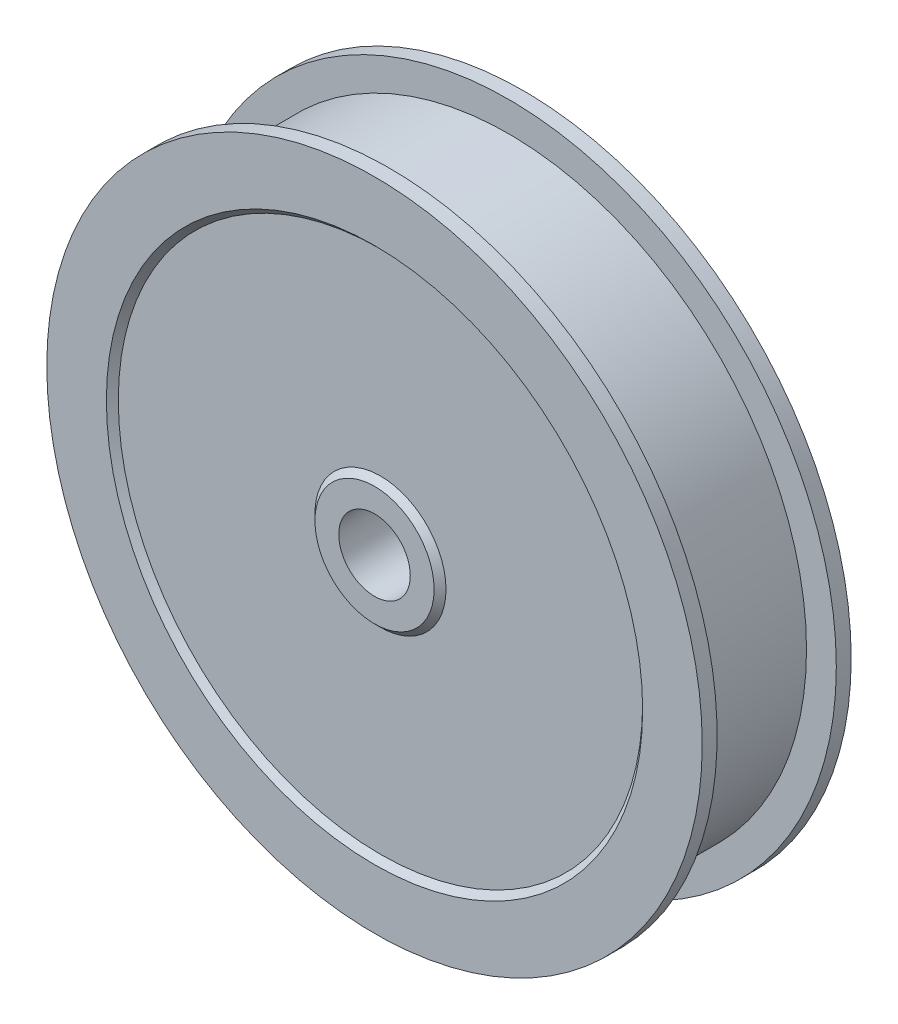
ISO-10303-21;
HEADER;
FILE_DESCRIPTION(('STEP AP214'),'2;1');
FILE_NAME('part.step','',(''),(''),'','','');
FILE_SCHEMA(('AUTOMOTIVE_DESIGN { 1 0 10303 214 1 1 1 1 }'));
ENDSEC;
DATA;
#1=APPLICATION_CONTEXT('core data for automotive mechanical design processes');
#2=APPLICATION_PROTOCOL_DEFINITION('international standard','automotive_design',2000,#1);
#3=PRODUCT_CONTEXT('',#1,'mechanical');
#4=PRODUCT('Part','Part','',(#3));
#5=PRODUCT_RELATED_PRODUCT_CATEGORY('part','',(#4));
#6=PRODUCT_DEFINITION_FORMATION('','',#4);
#7=PRODUCT_DEFINITION_CONTEXT('part definition',#1,'design');
#8=PRODUCT_DEFINITION('design','',#6,#7);
#9=PRODUCT_DEFINITION_SHAPE('','',#8);
#10=(LENGTH_UNIT() NAMED_UNIT(*) SI_UNIT(.MILLI.,.METRE.));
#11=(NAMED_UNIT(*) PLANE_ANGLE_UNIT() SI_UNIT($,.RADIAN.));
#12=(NAMED_UNIT(*) SI_UNIT($,.STERADIAN.) SOLID_ANGLE_UNIT());
#13=UNCERTAINTY_MEASURE_WITH_UNIT(LENGTH_MEASURE(1.E-05),#10,'distance_accuracy_value','');
#14=(GEOMETRIC_REPRESENTATION_CONTEXT(3) GLOBAL_UNCERTAINTY_ASSIGNED_CONTEXT((#13)) GLOBAL_UNIT_ASSIGNED_CONTEXT((#10,
#11,#12)) REPRESENTATION_CONTEXT('',''));
#15=CARTESIAN_POINT('',(0.,0.,0.));
#16=DIRECTION('',(0.,0.,1.));
#17=DIRECTION('',(1.,0.,0.));
#18=AXIS2_PLACEMENT_3D('',#15,#16,#17);
#19=CARTESIAN_POINT('',(0.,0.,0.));
#20=DIRECTION('',(0.,0.,1.));
#21=DIRECTION('',(1.,0.,0.));
#22=AXIS2_PLACEMENT_3D('',#19,#20,#21);
#23=PLANE('',#22);
#24=CARTESIAN_POINT('',(0.,0.,0.));
#25=DIRECTION('',(0.,0.,1.));
#26=DIRECTION('',(1.,0.,0.));
#27=AXIS2_PLACEMENT_3D('',#24,#25,#26);
#28=CIRCLE('',#27,6.);
#29=CARTESIAN_POINT('',(6.,0.,0.));
#30=VERTEX_POINT('',#29);
#31=EDGE_CURVE('E58',#30,#30,#28,.T.);
#32=ORIENTED_EDGE('',*,*,#31,.T.);
#33=EDGE_LOOP('',(#32));
#34=FACE_BOUND('',#33,.T.);
#35=CARTESIAN_POINT('',(0.,0.,0.));
#36=DIRECTION('',(0.,0.,1.));
#37=DIRECTION('',(1.,0.,0.));
#38=AXIS2_PLACEMENT_3D('',#35,#36,#37);
#39=CIRCLE('',#38,10.);
#40=CARTESIAN_POINT('',(10.,0.,0.));
#41=VERTEX_POINT('',#40);
#42=EDGE_CURVE('E87',#41,#41,#39,.T.);
#43=ORIENTED_EDGE('',*,*,#42,.F.);
#44=EDGE_LOOP('',(#43));
#45=FACE_BOUND('',#44,.T.);
#46=ADVANCED_FACE('F34',(#34,#45),#23,.F.);
#47=CARTESIAN_POINT('',(0.,0.,25.));
#48=DIRECTION('',(0.,0.,1.));
#49=DIRECTION('',(1.,0.,0.));
#50=AXIS2_PLACEMENT_3D('',#47,#48,#49);
#51=PLANE('',#50);
#52=CARTESIAN_POINT('',(0.,0.,25.));
#53=DIRECTION('',(0.,0.,1.));
#54=DIRECTION('',(1.,0.,0.));
#55=AXIS2_PLACEMENT_3D('',#52,#53,#54);
#56=CIRCLE('',#55,6.);
#57=CARTESIAN_POINT('',(6.,0.,25.));
#58=VERTEX_POINT('',#57);
#59=EDGE_CURVE('E66',#58,#58,#56,.T.);
#60=ORIENTED_EDGE('',*,*,#59,.F.);
#61=EDGE_LOOP('',(#60));
#62=FACE_BOUND('',#61,.T.);
#63=CARTESIAN_POINT('',(0.,0.,25.));
#64=DIRECTION('',(0.,0.,1.));
#65=DIRECTION('',(1.,0.,0.));
#66=AXIS2_PLACEMENT_3D('',#63,#64,#65);
#67=CIRCLE('',#66,10.);
#68=CARTESIAN_POINT('',(10.,0.,25.));
#69=VERTEX_POINT('',#68);
#70=EDGE_CURVE('E81',#69,#69,#67,.T.);
#71=ORIENTED_EDGE('',*,*,#70,.T.);
#72=EDGE_LOOP('',(#71));
#73=FACE_BOUND('',#72,.T.);
#74=ADVANCED_FACE('F94',(#62,#73),#51,.T.);
#75=CARTESIAN_POINT('',(0.,0.,25.));
#76=DIRECTION('',(0.,0.,-1.));
#77=DIRECTION('',(-1.,0.,0.));
#78=AXIS2_PLACEMENT_3D('',#75,#76,#77);
#79=CYLINDRICAL_SURFACE('',#78,55.);
#80=CARTESIAN_POINT('',(0.,0.,25.));
#81=DIRECTION('',(0.,0.,1.));
#82=DIRECTION('',(1.,0.,0.));
#83=AXIS2_PLACEMENT_3D('',#80,#81,#82);
#84=CIRCLE('',#83,55.);
#85=CARTESIAN_POINT('',(55.,0.,25.));
#86=VERTEX_POINT('',#85);
#87=EDGE_CURVE('E54',#86,#86,#84,.T.);
#88=ORIENTED_EDGE('',*,*,#87,.F.);
#89=EDGE_LOOP('',(#88));
#90=FACE_BOUND('',#89,.T.);
#91=CARTESIAN_POINT('',(0.,0.,22.5));
#92=DIRECTION('',(0.,0.,-1.));
#93=DIRECTION('',(-1.,0.,0.));
#94=AXIS2_PLACEMENT_3D('',#91,#92,#93);
#95=CIRCLE('',#94,55.);
#96=CARTESIAN_POINT('',(-55.,0.,22.5));
#97=VERTEX_POINT('',#96);
#98=EDGE_CURVE('E55',#97,#97,#95,.T.);
#99=ORIENTED_EDGE('',*,*,#98,.F.);
#100=EDGE_LOOP('',(#99));
#101=FACE_BOUND('',#100,.T.);
#102=ADVANCED_FACE('F101',(#90,#101),#79,.T.);
#103=CARTESIAN_POINT('',(0.,0.,0.));
#104=DIRECTION('',(0.,0.,1.));
#105=DIRECTION('',(1.,0.,0.));
#106=AXIS2_PLACEMENT_3D('',#103,#104,#105);
#107=CIRCLE('',#106,55.);
#108=CARTESIAN_POINT('',(55.,0.,0.));
#109=VERTEX_POINT('',#108);
#110=EDGE_CURVE('E63',#109,#109,#107,.T.);
#111=ORIENTED_EDGE('',*,*,#110,.T.);
#112=EDGE_LOOP('',(#111));
#113=FACE_BOUND('',#112,.T.);
#114=CARTESIAN_POINT('',(0.,0.,2.5));
#115=DIRECTION('',(0.,0.,1.));
#116=DIRECTION('',(1.,0.,0.));
#117=AXIS2_PLACEMENT_3D('',#114,#115,#116);
#118=CIRCLE('',#117,55.);
#119=CARTESIAN_POINT('',(55.,0.,2.5));
#120=VERTEX_POINT('',#119);
#121=EDGE_CURVE('E59',#120,#120,#118,.T.);
#122=ORIENTED_EDGE('',*,*,#121,.F.);
#123=EDGE_LOOP('',(#122));
#124=FACE_BOUND('',#123,.T.);
#125=ADVANCED_FACE('F116',(#113,#124),#79,.T.);
#126=CARTESIAN_POINT('',(0.,0.,25.));
#127=DIRECTION('',(0.,0.,1.));
#128=DIRECTION('',(1.,0.,0.));
#129=AXIS2_PLACEMENT_3D('',#126,#127,#128);
#130=CIRCLE('',#129,45.);
#131=CARTESIAN_POINT('',(45.,0.,25.));
#132=VERTEX_POINT('',#131);
#133=EDGE_CURVE('E78',#132,#132,#130,.T.);
#134=ORIENTED_EDGE('',*,*,#133,.F.);
#135=EDGE_LOOP('',(#134));
#136=FACE_BOUND('',#135,.T.);
#137=ORIENTED_EDGE('',*,*,#87,.T.);
#138=EDGE_LOOP('',(#137));
#139=FACE_BOUND('',#138,.T.);
#140=ADVANCED_FACE('F104',(#136,#139),#51,.T.);
#141=CARTESIAN_POINT('',(0.,0.,0.));
#142=DIRECTION('',(0.,0.,1.));
#143=DIRECTION('',(1.,0.,0.));
#144=AXIS2_PLACEMENT_3D('',#141,#142,#143);
#145=CIRCLE('',#144,45.);
#146=CARTESIAN_POINT('',(45.,0.,0.));
#147=VERTEX_POINT('',#146);
#148=EDGE_CURVE('E84',#147,#147,#145,.T.);
#149=ORIENTED_EDGE('',*,*,#148,.T.);
#150=EDGE_LOOP('',(#149));
#151=FACE_BOUND('',#150,.T.);
#152=ORIENTED_EDGE('',*,*,#110,.F.);
#153=EDGE_LOOP('',(#152));
#154=FACE_BOUND('',#153,.T.);
#155=ADVANCED_FACE('F97',(#151,#154),#23,.F.);
#156=CARTESIAN_POINT('',(0.,0.,25.));
#157=DIRECTION('',(0.,0.,-1.));
#158=DIRECTION('',(-1.,0.,0.));
#159=AXIS2_PLACEMENT_3D('',#156,#157,#158);
#160=CYLINDRICAL_SURFACE('',#159,6.);
#161=ORIENTED_EDGE('',*,*,#59,.T.);
#162=EDGE_LOOP('',(#161));
#163=FACE_BOUND('',#162,.T.);
#164=ORIENTED_EDGE('',*,*,#31,.F.);
#165=EDGE_LOOP('',(#164));
#166=FACE_BOUND('',#165,.T.);
#167=ADVANCED_FACE('F107',(#163,#166),#160,.F.);
#168=CARTESIAN_POINT('',(0.,50.,22.5));
#169=DIRECTION('',(0.,0.,-1.));
#170=DIRECTION('',(-1.,0.,0.));
#171=AXIS2_PLACEMENT_3D('',#168,#169,#170);
#172=PLANE('',#171);
#173=CARTESIAN_POINT('',(0.,0.,22.5));
#174=DIRECTION('',(0.,0.,1.));
#175=DIRECTION('',(1.,0.,0.));
#176=AXIS2_PLACEMENT_3D('',#173,#174,#175);
#177=CIRCLE('',#176,50.);
#178=CARTESIAN_POINT('',(50.,0.,22.5));
#179=VERTEX_POINT('',#178);
#180=EDGE_CURVE('E62',#179,#179,#177,.T.);
#181=ORIENTED_EDGE('',*,*,#180,.T.);
#182=EDGE_LOOP('',(#181));
#183=FACE_BOUND('',#182,.T.);
#184=ORIENTED_EDGE('',*,*,#98,.T.);
#185=EDGE_LOOP('',(#184));
#186=FACE_BOUND('',#185,.T.);
#187=ADVANCED_FACE('F113',(#183,#186),#172,.T.);
#188=CARTESIAN_POINT('',(0.,50.,2.5));
#189=DIRECTION('',(0.,0.,1.));
#190=DIRECTION('',(1.,0.,0.));
#191=AXIS2_PLACEMENT_3D('',#188,#189,#190);
#192=PLANE('',#191);
#193=CARTESIAN_POINT('',(0.,0.,2.5));
#194=DIRECTION('',(0.,0.,1.));
#195=DIRECTION('',(1.,0.,0.));
#196=AXIS2_PLACEMENT_3D('',#193,#194,#195);
#197=CIRCLE('',#196,50.);
#198=CARTESIAN_POINT('',(50.,0.,2.5));
#199=VERTEX_POINT('',#198);
#200=EDGE_CURVE('E75',#199,#199,#197,.T.);
#201=ORIENTED_EDGE('',*,*,#200,.F.);
#202=EDGE_LOOP('',(#201));
#203=FACE_BOUND('',#202,.T.);
#204=ORIENTED_EDGE('',*,*,#121,.T.);
#205=EDGE_LOOP('',(#204));
#206=FACE_BOUND('',#205,.T.);
#207=ADVANCED_FACE('F126',(#203,#206),#192,.T.);
#208=CARTESIAN_POINT('',(0.,0.,25.));
#209=DIRECTION('',(0.,0.,1.));
#210=DIRECTION('',(1.,0.,0.));
#211=AXIS2_PLACEMENT_3D('',#208,#209,#210);
#212=CYLINDRICAL_SURFACE('',#211,50.);
#213=ORIENTED_EDGE('',*,*,#200,.T.);
#214=EDGE_LOOP('',(#213));
#215=FACE_BOUND('',#214,.T.);
#216=ORIENTED_EDGE('',*,*,#180,.F.);
#217=EDGE_LOOP('',(#216));
#218=FACE_BOUND('',#217,.T.);
#219=ADVANCED_FACE('F128',(#215,#218),#212,.T.);
#220=CARTESIAN_POINT('',(0.,0.,24.));
#221=DIRECTION('',(0.,0.,1.));
#222=DIRECTION('',(1.,0.,0.));
#223=AXIS2_PLACEMENT_3D('',#220,#221,#222);
#224=PLANE('',#223);
#225=CARTESIAN_POINT('',(0.,0.,24.));
#226=DIRECTION('',(0.,0.,1.));
#227=DIRECTION('',(1.,0.,0.));
#228=AXIS2_PLACEMENT_3D('',#225,#226,#227);
#229=CIRCLE('',#228,44.);
#230=CARTESIAN_POINT('',(44.,0.,24.));
#231=VERTEX_POINT('',#230);
#232=EDGE_CURVE('E45',#231,#231,#229,.T.);
#233=ORIENTED_EDGE('',*,*,#232,.T.);
#234=EDGE_LOOP('',(#233));
#235=FACE_BOUND('',#234,.T.);
#236=CARTESIAN_POINT('',(0.,0.,24.));
#237=DIRECTION('',(0.,0.,1.));
#238=DIRECTION('',(1.,0.,0.));
#239=AXIS2_PLACEMENT_3D('',#236,#237,#238);
#240=CIRCLE('',#239,11.);
#241=CARTESIAN_POINT('',(11.,0.,24.));
#242=VERTEX_POINT('',#241);
#243=EDGE_CURVE('E49',#242,#242,#240,.F.);
#244=ORIENTED_EDGE('',*,*,#243,.T.);
#245=EDGE_LOOP('',(#244));
#246=FACE_BOUND('',#245,.T.);
#247=ADVANCED_FACE('F135',(#235,#246),#224,.T.);
#248=CARTESIAN_POINT('',(0.,0.,24.));
#249=DIRECTION('',(0.,0.,1.));
#250=DIRECTION('',(1.,0.,0.));
#251=AXIS2_PLACEMENT_3D('',#248,#249,#250);
#252=CONICAL_SURFACE('',#251,44.,0.785398163397466);
#253=ORIENTED_EDGE('',*,*,#133,.T.);
#254=EDGE_LOOP('',(#253));
#255=FACE_BOUND('',#254,.T.);
#256=ORIENTED_EDGE('',*,*,#232,.F.);
#257=EDGE_LOOP('',(#256));
#258=FACE_BOUND('',#257,.T.);
#259=ADVANCED_FACE('F144',(#255,#258),#252,.F.);
#260=CARTESIAN_POINT('',(0.,0.,25.));
#261=DIRECTION('',(0.,0.,-1.));
#262=DIRECTION('',(-1.,0.,0.));
#263=AXIS2_PLACEMENT_3D('',#260,#261,#262);
#264=CONICAL_SURFACE('',#263,10.,0.785398163397439);
#265=ORIENTED_EDGE('',*,*,#243,.F.);
#266=EDGE_LOOP('',(#265));
#267=FACE_BOUND('',#266,.T.);
#268=ORIENTED_EDGE('',*,*,#70,.F.);
#269=EDGE_LOOP('',(#268));
#270=FACE_BOUND('',#269,.T.);
#271=ADVANCED_FACE('F149',(#267,#270),#264,.T.);
#272=CARTESIAN_POINT('',(0.,0.,1.));
#273=DIRECTION('',(0.,0.,-1.));
#274=DIRECTION('',(1.,0.,0.));
#275=AXIS2_PLACEMENT_3D('',#272,#273,#274);
#276=PLANE('',#275);
#277=CARTESIAN_POINT('',(0.,0.,1.));
#278=DIRECTION('',(0.,0.,-1.));
#279=DIRECTION('',(-1.,0.,0.));
#280=AXIS2_PLACEMENT_3D('',#277,#278,#279);
#281=CIRCLE('',#280,44.);
#282=CARTESIAN_POINT('',(-44.,0.,1.));
#283=VERTEX_POINT('',#282);
#284=EDGE_CURVE('E10',#283,#283,#281,.T.);
#285=ORIENTED_EDGE('',*,*,#284,.T.);
#286=EDGE_LOOP('',(#285));
#287=FACE_BOUND('',#286,.T.);
#288=CARTESIAN_POINT('',(0.,0.,1.));
#289=DIRECTION('',(0.,0.,-1.));
#290=DIRECTION('',(-1.,0.,0.));
#291=AXIS2_PLACEMENT_3D('',#288,#289,#290);
#292=CIRCLE('',#291,11.);
#293=CARTESIAN_POINT('',(-11.,0.,1.));
#294=VERTEX_POINT('',#293);
#295=EDGE_CURVE('E41',#294,#294,#292,.F.);
#296=ORIENTED_EDGE('',*,*,#295,.T.);
#297=EDGE_LOOP('',(#296));
#298=FACE_BOUND('',#297,.T.);
#299=ADVANCED_FACE('F146',(#287,#298),#276,.T.);
#300=CARTESIAN_POINT('',(0.,0.,0.));
#301=DIRECTION('',(0.,0.,-1.));
#302=DIRECTION('',(-1.,0.,0.));
#303=AXIS2_PLACEMENT_3D('',#300,#301,#302);
#304=CONICAL_SURFACE('',#303,45.,0.785398163397443);
#305=ORIENTED_EDGE('',*,*,#284,.F.);
#306=EDGE_LOOP('',(#305));
#307=FACE_BOUND('',#306,.T.);
#308=ORIENTED_EDGE('',*,*,#148,.F.);
#309=EDGE_LOOP('',(#308));
#310=FACE_BOUND('',#309,.T.);
#311=ADVANCED_FACE('F148',(#307,#310),#304,.F.);
#312=CARTESIAN_POINT('',(0.,0.,1.));
#313=DIRECTION('',(0.,0.,1.));
#314=DIRECTION('',(1.,0.,0.));
#315=AXIS2_PLACEMENT_3D('',#312,#313,#314);
#316=CONICAL_SURFACE('',#315,11.,0.785398163397454);
#317=ORIENTED_EDGE('',*,*,#42,.T.);
#318=EDGE_LOOP('',(#317));
#319=FACE_BOUND('',#318,.T.);
#320=ORIENTED_EDGE('',*,*,#295,.F.);
#321=EDGE_LOOP('',(#320));
#322=FACE_BOUND('',#321,.T.);
#323=ADVANCED_FACE('F36',(#319,#322),#316,.T.);
#324=CLOSED_SHELL('',(#46,#74,#102,#125,#140,#155,#167,#187,#207,#219,#247,#259,#271,#299,#311,#323));
#325=MANIFOLD_SOLID_BREP('B2',#324);
#326=ADVANCED_BREP_SHAPE_REPRESENTATION('',(#18,#325),#14);
#327=SHAPE_DEFINITION_REPRESENTATION(#9,#326);
ENDSEC;
END-ISO-10303-21;
